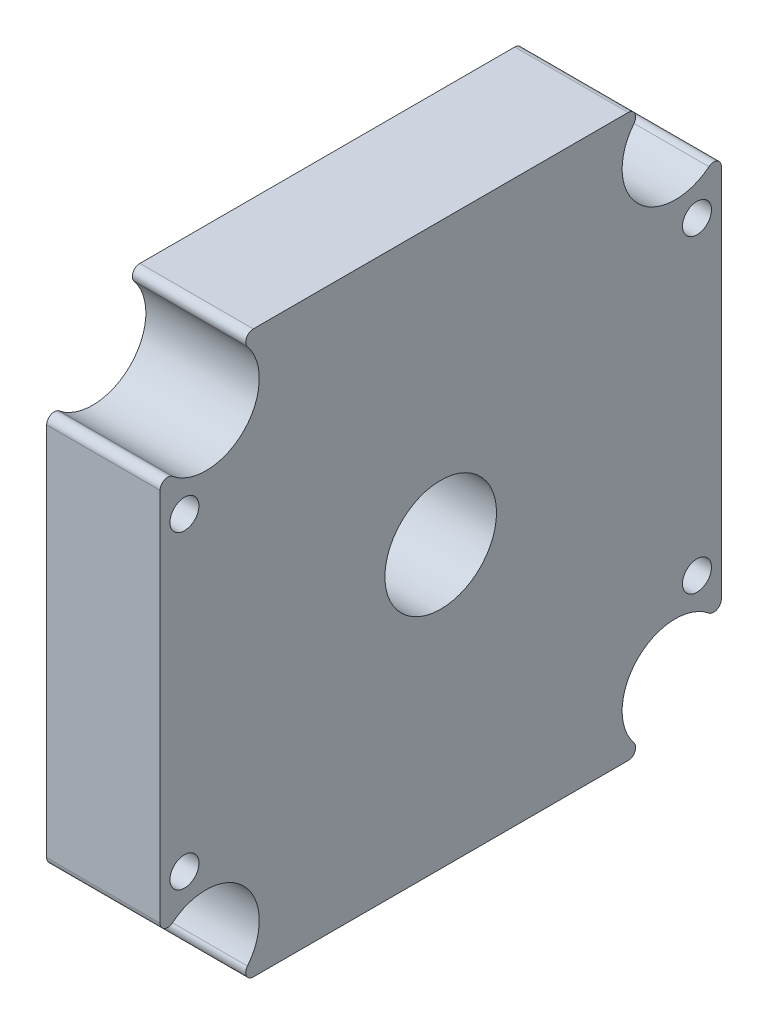
ISO-10303-21;
HEADER;
FILE_DESCRIPTION(('STEP AP214'),'2;1');
FILE_NAME('part.step','',(''),(''),'','','');
FILE_SCHEMA(('AUTOMOTIVE_DESIGN { 1 0 10303 214 1 1 1 1 }'));
ENDSEC;
DATA;
#1=APPLICATION_CONTEXT('core data for automotive mechanical design processes');
#2=APPLICATION_PROTOCOL_DEFINITION('international standard','automotive_design',2000,#1);
#3=PRODUCT_CONTEXT('',#1,'mechanical');
#4=PRODUCT('Part','Part','',(#3));
#5=PRODUCT_RELATED_PRODUCT_CATEGORY('part','',(#4));
#6=PRODUCT_DEFINITION_FORMATION('','',#4);
#7=PRODUCT_DEFINITION_CONTEXT('part definition',#1,'design');
#8=PRODUCT_DEFINITION('design','',#6,#7);
#9=PRODUCT_DEFINITION_SHAPE('','',#8);
#10=(LENGTH_UNIT() NAMED_UNIT(*) SI_UNIT(.MILLI.,.METRE.));
#11=(NAMED_UNIT(*) PLANE_ANGLE_UNIT() SI_UNIT($,.RADIAN.));
#12=(NAMED_UNIT(*) SI_UNIT($,.STERADIAN.) SOLID_ANGLE_UNIT());
#13=UNCERTAINTY_MEASURE_WITH_UNIT(LENGTH_MEASURE(1.E-05),#10,'distance_accuracy_value','');
#14=(GEOMETRIC_REPRESENTATION_CONTEXT(3) GLOBAL_UNCERTAINTY_ASSIGNED_CONTEXT((#13)) GLOBAL_UNIT_ASSIGNED_CONTEXT((#10,
#11,#12)) REPRESENTATION_CONTEXT('',''));
#15=CARTESIAN_POINT('',(0.,0.,0.));
#16=DIRECTION('',(0.,0.,1.));
#17=DIRECTION('',(1.,0.,0.));
#18=AXIS2_PLACEMENT_3D('',#15,#16,#17);
#19=CARTESIAN_POINT('',(11.3538,-28.0924,-28.0924));
#20=DIRECTION('',(0.,0.,1.));
#21=DIRECTION('',(1.,0.,0.));
#22=AXIS2_PLACEMENT_3D('',#19,#20,#21);
#23=PLANE('',#22);
#24=DIRECTION('',(0.,1.,0.));
#25=VECTOR('',#24,1.);
#26=CARTESIAN_POINT('',(11.3538,-28.0924,-28.0924));
#27=LINE('',#26,#25);
#28=CARTESIAN_POINT('',(11.3538,-18.7567595206659,-28.0924));
#29=VERTEX_POINT('',#28);
#30=CARTESIAN_POINT('',(11.3538,18.7567595206659,-28.0924));
#31=VERTEX_POINT('',#30);
#32=EDGE_CURVE('E258',#29,#31,#27,.T.);
#33=ORIENTED_EDGE('',*,*,#32,.F.);
#34=DIRECTION('',(-1.,0.,0.));
#35=VECTOR('',#34,1.);
#36=CARTESIAN_POINT('',(11.3538,-18.7567595206659,-28.0924));
#37=LINE('',#36,#35);
#38=CARTESIAN_POINT('',(0.,-18.7567595206659,-28.0924));
#39=VERTEX_POINT('',#38);
#40=EDGE_CURVE('E234',#29,#39,#37,.T.);
#41=ORIENTED_EDGE('',*,*,#40,.T.);
#42=DIRECTION('',(0.,1.,0.));
#43=VECTOR('',#42,1.);
#44=CARTESIAN_POINT('',(0.,-28.0924,-28.0924));
#45=LINE('',#44,#43);
#46=CARTESIAN_POINT('',(0.,18.7567595206659,-28.0924));
#47=VERTEX_POINT('',#46);
#48=EDGE_CURVE('E260',#39,#47,#45,.T.);
#49=ORIENTED_EDGE('',*,*,#48,.T.);
#50=DIRECTION('',(-1.,0.,0.));
#51=VECTOR('',#50,1.);
#52=CARTESIAN_POINT('',(11.3538,18.7567595206659,-28.0924));
#53=LINE('',#52,#51);
#54=EDGE_CURVE('E231',#47,#31,#53,.F.);
#55=ORIENTED_EDGE('',*,*,#54,.T.);
#56=EDGE_LOOP('',(#33,#41,#49,#55));
#57=FACE_BOUND('',#56,.T.);
#58=ADVANCED_FACE('F45',(#57),#23,.F.);
#59=CARTESIAN_POINT('',(11.3538,28.0924,28.0924));
#60=DIRECTION('',(0.,-1.,0.));
#61=DIRECTION('',(0.,0.,-1.));
#62=AXIS2_PLACEMENT_3D('',#59,#60,#61);
#63=PLANE('',#62);
#64=DIRECTION('',(0.,0.,1.));
#65=VECTOR('',#64,1.);
#66=CARTESIAN_POINT('',(11.3538,28.0924,28.0924));
#67=LINE('',#66,#65);
#68=CARTESIAN_POINT('',(11.3538,28.0924,-18.756759520666));
#69=VERTEX_POINT('',#68);
#70=CARTESIAN_POINT('',(11.3538,28.0924,18.7567595206659));
#71=VERTEX_POINT('',#70);
#72=EDGE_CURVE('E179',#69,#71,#67,.T.);
#73=ORIENTED_EDGE('',*,*,#72,.F.);
#74=DIRECTION('',(-1.,0.,0.));
#75=VECTOR('',#74,1.);
#76=CARTESIAN_POINT('',(11.3538,28.0924,-18.756759520666));
#77=LINE('',#76,#75);
#78=CARTESIAN_POINT('',(0.,28.0924,-18.756759520666));
#79=VERTEX_POINT('',#78);
#80=EDGE_CURVE('E240',#69,#79,#77,.T.);
#81=ORIENTED_EDGE('',*,*,#80,.T.);
#82=DIRECTION('',(0.,0.,1.));
#83=VECTOR('',#82,1.);
#84=CARTESIAN_POINT('',(0.,28.0924,28.0924));
#85=LINE('',#84,#83);
#86=CARTESIAN_POINT('',(0.,28.0924,18.7567595206659));
#87=VERTEX_POINT('',#86);
#88=EDGE_CURVE('E274',#79,#87,#85,.T.);
#89=ORIENTED_EDGE('',*,*,#88,.T.);
#90=DIRECTION('',(-1.,0.,0.));
#91=VECTOR('',#90,1.);
#92=CARTESIAN_POINT('',(11.3538,28.0924,18.7567595206659));
#93=LINE('',#92,#91);
#94=EDGE_CURVE('E237',#87,#71,#93,.F.);
#95=ORIENTED_EDGE('',*,*,#94,.T.);
#96=EDGE_LOOP('',(#73,#81,#89,#95));
#97=FACE_BOUND('',#96,.T.);
#98=ADVANCED_FACE('F309',(#97),#63,.F.);
#99=CARTESIAN_POINT('',(11.3538,-28.0924,28.0924));
#100=DIRECTION('',(0.,0.,-1.));
#101=DIRECTION('',(-1.,0.,0.));
#102=AXIS2_PLACEMENT_3D('',#99,#100,#101);
#103=PLANE('',#102);
#104=DIRECTION('',(0.,-1.,0.));
#105=VECTOR('',#104,1.);
#106=CARTESIAN_POINT('',(11.3538,-28.0924,28.0924));
#107=LINE('',#106,#105);
#108=CARTESIAN_POINT('',(11.3538,18.7567595206659,28.0924));
#109=VERTEX_POINT('',#108);
#110=CARTESIAN_POINT('',(11.3538,-18.7567595206659,28.0924));
#111=VERTEX_POINT('',#110);
#112=EDGE_CURVE('E160',#109,#111,#107,.T.);
#113=ORIENTED_EDGE('',*,*,#112,.F.);
#114=DIRECTION('',(-1.,0.,0.));
#115=VECTOR('',#114,1.);
#116=CARTESIAN_POINT('',(11.3538,18.7567595206659,28.0924));
#117=LINE('',#116,#115);
#118=CARTESIAN_POINT('',(0.,18.7567595206659,28.0924));
#119=VERTEX_POINT('',#118);
#120=EDGE_CURVE('E174',#109,#119,#117,.T.);
#121=ORIENTED_EDGE('',*,*,#120,.T.);
#122=DIRECTION('',(0.,-1.,0.));
#123=VECTOR('',#122,1.);
#124=CARTESIAN_POINT('',(0.,-28.0924,28.0924));
#125=LINE('',#124,#123);
#126=CARTESIAN_POINT('',(0.,-18.7567595206659,28.0924));
#127=VERTEX_POINT('',#126);
#128=EDGE_CURVE('E268',#119,#127,#125,.T.);
#129=ORIENTED_EDGE('',*,*,#128,.T.);
#130=DIRECTION('',(-1.,0.,0.));
#131=VECTOR('',#130,1.);
#132=CARTESIAN_POINT('',(11.3538,-18.7567595206659,28.0924));
#133=LINE('',#132,#131);
#134=EDGE_CURVE('E177',#127,#111,#133,.F.);
#135=ORIENTED_EDGE('',*,*,#134,.T.);
#136=EDGE_LOOP('',(#113,#121,#129,#135));
#137=FACE_BOUND('',#136,.T.);
#138=ADVANCED_FACE('F172',(#137),#103,.F.);
#139=CARTESIAN_POINT('',(11.3538,-28.0924,28.0924));
#140=DIRECTION('',(0.,1.,0.));
#141=DIRECTION('',(0.,0.,1.));
#142=AXIS2_PLACEMENT_3D('',#139,#140,#141);
#143=PLANE('',#142);
#144=DIRECTION('',(0.,0.,-1.));
#145=VECTOR('',#144,1.);
#146=CARTESIAN_POINT('',(11.3538,-28.0924,28.0924));
#147=LINE('',#146,#145);
#148=CARTESIAN_POINT('',(11.3538,-28.0924,18.756759520666));
#149=VERTEX_POINT('',#148);
#150=CARTESIAN_POINT('',(11.3538,-28.0924,-18.7567595206659));
#151=VERTEX_POINT('',#150);
#152=EDGE_CURVE('E178',#149,#151,#147,.T.);
#153=ORIENTED_EDGE('',*,*,#152,.F.);
#154=DIRECTION('',(-1.,0.,0.));
#155=VECTOR('',#154,1.);
#156=CARTESIAN_POINT('',(11.3538,-28.0924,18.756759520666));
#157=LINE('',#156,#155);
#158=CARTESIAN_POINT('',(0.,-28.0924,18.756759520666));
#159=VERTEX_POINT('',#158);
#160=EDGE_CURVE('E224',#149,#159,#157,.T.);
#161=ORIENTED_EDGE('',*,*,#160,.T.);
#162=DIRECTION('',(0.,0.,-1.));
#163=VECTOR('',#162,1.);
#164=CARTESIAN_POINT('',(0.,-28.0924,28.0924));
#165=LINE('',#164,#163);
#166=CARTESIAN_POINT('',(0.,-28.0924,-18.7567595206659));
#167=VERTEX_POINT('',#166);
#168=EDGE_CURVE('E263',#159,#167,#165,.T.);
#169=ORIENTED_EDGE('',*,*,#168,.T.);
#170=DIRECTION('',(-1.,0.,0.));
#171=VECTOR('',#170,1.);
#172=CARTESIAN_POINT('',(11.3538,-28.0924,-18.7567595206659));
#173=LINE('',#172,#171);
#174=EDGE_CURVE('E221',#167,#151,#173,.F.);
#175=ORIENTED_EDGE('',*,*,#174,.T.);
#176=EDGE_LOOP('',(#153,#161,#169,#175));
#177=FACE_BOUND('',#176,.T.);
#178=ADVANCED_FACE('F360',(#177),#143,.F.);
#179=CARTESIAN_POINT('',(11.3538,0.,0.));
#180=DIRECTION('',(-1.,0.,0.));
#181=DIRECTION('',(0.,0.,1.));
#182=AXIS2_PLACEMENT_3D('',#179,#180,#181);
#183=PLANE('',#182);
#184=CARTESIAN_POINT('',(11.3538,0.,0.));
#185=DIRECTION('',(1.,0.,0.));
#186=DIRECTION('',(0.,0.,-1.));
#187=AXIS2_PLACEMENT_3D('',#184,#185,#186);
#188=CIRCLE('',#187,5.588);
#189=CARTESIAN_POINT('',(11.3538,0.,-5.588));
#190=VERTEX_POINT('',#189);
#191=EDGE_CURVE('E343',#190,#190,#188,.T.);
#192=ORIENTED_EDGE('',*,*,#191,.F.);
#193=EDGE_LOOP('',(#192));
#194=FACE_BOUND('',#193,.T.);
#195=CARTESIAN_POINT('',(11.3538,15.494,25.654));
#196=DIRECTION('',(1.,0.,0.));
#197=DIRECTION('',(0.,0.,-1.));
#198=AXIS2_PLACEMENT_3D('',#195,#196,#197);
#199=CIRCLE('',#198,1.45);
#200=CARTESIAN_POINT('',(11.3538,15.494,24.204));
#201=VERTEX_POINT('',#200);
#202=EDGE_CURVE('E339',#201,#201,#199,.T.);
#203=ORIENTED_EDGE('',*,*,#202,.F.);
#204=EDGE_LOOP('',(#203));
#205=FACE_BOUND('',#204,.T.);
#206=CARTESIAN_POINT('',(11.3538,15.494,-25.654));
#207=DIRECTION('',(1.,0.,0.));
#208=DIRECTION('',(0.,0.,-1.));
#209=AXIS2_PLACEMENT_3D('',#206,#207,#208);
#210=CIRCLE('',#209,1.45);
#211=CARTESIAN_POINT('',(11.3538,15.494,-27.104));
#212=VERTEX_POINT('',#211);
#213=EDGE_CURVE('E333',#212,#212,#210,.T.);
#214=ORIENTED_EDGE('',*,*,#213,.F.);
#215=EDGE_LOOP('',(#214));
#216=FACE_BOUND('',#215,.T.);
#217=CARTESIAN_POINT('',(11.3538,-15.494,-25.654));
#218=DIRECTION('',(1.,0.,0.));
#219=DIRECTION('',(0.,0.,-1.));
#220=AXIS2_PLACEMENT_3D('',#217,#218,#219);
#221=CIRCLE('',#220,1.45);
#222=CARTESIAN_POINT('',(11.3538,-15.494,-27.104));
#223=VERTEX_POINT('',#222);
#224=EDGE_CURVE('E327',#223,#223,#221,.T.);
#225=ORIENTED_EDGE('',*,*,#224,.F.);
#226=EDGE_LOOP('',(#225));
#227=FACE_BOUND('',#226,.T.);
#228=CARTESIAN_POINT('',(11.3538,-15.494,25.654));
#229=DIRECTION('',(1.,0.,0.));
#230=DIRECTION('',(0.,0.,-1.));
#231=AXIS2_PLACEMENT_3D('',#228,#229,#230);
#232=CIRCLE('',#231,1.45);
#233=CARTESIAN_POINT('',(11.3538,-15.494,24.204));
#234=VERTEX_POINT('',#233);
#235=EDGE_CURVE('E321',#234,#234,#232,.T.);
#236=ORIENTED_EDGE('',*,*,#235,.F.);
#237=EDGE_LOOP('',(#236));
#238=FACE_BOUND('',#237,.T.);
#239=CARTESIAN_POINT('',(11.3538,23.495,23.495));
#240=DIRECTION('',(-1.,0.,0.));
#241=DIRECTION('',(0.,0.,1.));
#242=AXIS2_PLACEMENT_3D('',#239,#240,#241);
#243=CIRCLE('',#242,5.334);
#244=CARTESIAN_POINT('',(11.3538,26.850975,19.3490395805827));
#245=VERTEX_POINT('',#244);
#246=CARTESIAN_POINT('',(11.3538,19.3490395805827,26.850975));
#247=VERTEX_POINT('',#246);
#248=EDGE_CURVE('E162',#245,#247,#243,.T.);
#249=ORIENTED_EDGE('',*,*,#248,.T.);
#250=CARTESIAN_POINT('',(11.3538,18.7567595206659,27.3304));
#251=DIRECTION('',(-1.,0.,0.));
#252=DIRECTION('',(0.,0.,1.));
#253=AXIS2_PLACEMENT_3D('',#250,#251,#252);
#254=CIRCLE('',#253,0.762);
#255=EDGE_CURVE('E157',#247,#109,#254,.F.);
#256=ORIENTED_EDGE('',*,*,#255,.T.);
#257=ORIENTED_EDGE('',*,*,#112,.T.);
#258=CARTESIAN_POINT('',(11.3538,-18.7567595206659,27.3304));
#259=DIRECTION('',(-1.,0.,0.));
#260=DIRECTION('',(0.,0.,1.));
#261=AXIS2_PLACEMENT_3D('',#258,#259,#260);
#262=CIRCLE('',#261,0.762);
#263=CARTESIAN_POINT('',(11.3538,-19.3490395805826,26.850975));
#264=VERTEX_POINT('',#263);
#265=EDGE_CURVE('E167',#111,#264,#262,.F.);
#266=ORIENTED_EDGE('',*,*,#265,.T.);
#267=CARTESIAN_POINT('',(11.3538,-23.495,23.495));
#268=DIRECTION('',(-1.,0.,0.));
#269=DIRECTION('',(0.,0.,1.));
#270=AXIS2_PLACEMENT_3D('',#267,#268,#269);
#271=CIRCLE('',#270,5.334);
#272=CARTESIAN_POINT('',(11.3538,-26.850975,19.3490395805827));
#273=VERTEX_POINT('',#272);
#274=EDGE_CURVE('E283',#264,#273,#271,.T.);
#275=ORIENTED_EDGE('',*,*,#274,.T.);
#276=CARTESIAN_POINT('',(11.3538,-27.3304,18.756759520666));
#277=DIRECTION('',(-1.,0.,0.));
#278=DIRECTION('',(0.,0.,1.));
#279=AXIS2_PLACEMENT_3D('',#276,#277,#278);
#280=CIRCLE('',#279,0.762);
#281=EDGE_CURVE('E215',#273,#149,#280,.F.);
#282=ORIENTED_EDGE('',*,*,#281,.T.);
#283=ORIENTED_EDGE('',*,*,#152,.T.);
#284=CARTESIAN_POINT('',(11.3538,-27.3304,-18.7567595206659));
#285=DIRECTION('',(-1.,0.,0.));
#286=DIRECTION('',(0.,0.,1.));
#287=AXIS2_PLACEMENT_3D('',#284,#285,#286);
#288=CIRCLE('',#287,0.762);
#289=CARTESIAN_POINT('',(11.3538,-26.850975,-19.3490395805827));
#290=VERTEX_POINT('',#289);
#291=EDGE_CURVE('E213',#151,#290,#288,.F.);
#292=ORIENTED_EDGE('',*,*,#291,.T.);
#293=CARTESIAN_POINT('',(11.3538,-23.495,-23.495));
#294=DIRECTION('',(-1.,0.,0.));
#295=DIRECTION('',(0.,0.,1.));
#296=AXIS2_PLACEMENT_3D('',#293,#294,#295);
#297=CIRCLE('',#296,5.334);
#298=CARTESIAN_POINT('',(11.3538,-19.3490395805827,-26.850975));
#299=VERTEX_POINT('',#298);
#300=EDGE_CURVE('E295',#290,#299,#297,.T.);
#301=ORIENTED_EDGE('',*,*,#300,.T.);
#302=CARTESIAN_POINT('',(11.3538,-18.7567595206659,-27.3304));
#303=DIRECTION('',(-1.,0.,0.));
#304=DIRECTION('',(0.,0.,1.));
#305=AXIS2_PLACEMENT_3D('',#302,#303,#304);
#306=CIRCLE('',#305,0.762);
#307=EDGE_CURVE('E211',#299,#29,#306,.F.);
#308=ORIENTED_EDGE('',*,*,#307,.T.);
#309=ORIENTED_EDGE('',*,*,#32,.T.);
#310=CARTESIAN_POINT('',(11.3538,18.7567595206659,-27.3304));
#311=DIRECTION('',(-1.,0.,0.));
#312=DIRECTION('',(0.,0.,1.));
#313=AXIS2_PLACEMENT_3D('',#310,#311,#312);
#314=CIRCLE('',#313,0.762);
#315=CARTESIAN_POINT('',(11.3538,19.3490395805826,-26.850975));
#316=VERTEX_POINT('',#315);
#317=EDGE_CURVE('E65',#31,#316,#314,.F.);
#318=ORIENTED_EDGE('',*,*,#317,.T.);
#319=CARTESIAN_POINT('',(11.3538,23.495,-23.495));
#320=DIRECTION('',(-1.,0.,0.));
#321=DIRECTION('',(0.,0.,1.));
#322=AXIS2_PLACEMENT_3D('',#319,#320,#321);
#323=CIRCLE('',#322,5.334);
#324=CARTESIAN_POINT('',(11.3538,26.850975,-19.3490395805827));
#325=VERTEX_POINT('',#324);
#326=EDGE_CURVE('E246',#316,#325,#323,.T.);
#327=ORIENTED_EDGE('',*,*,#326,.T.);
#328=CARTESIAN_POINT('',(11.3538,27.3304,-18.756759520666));
#329=DIRECTION('',(-1.,0.,0.));
#330=DIRECTION('',(0.,0.,1.));
#331=AXIS2_PLACEMENT_3D('',#328,#329,#330);
#332=CIRCLE('',#331,0.762);
#333=EDGE_CURVE('E209',#325,#69,#332,.F.);
#334=ORIENTED_EDGE('',*,*,#333,.T.);
#335=ORIENTED_EDGE('',*,*,#72,.T.);
#336=CARTESIAN_POINT('',(11.3538,27.3304,18.7567595206659));
#337=DIRECTION('',(-1.,0.,0.));
#338=DIRECTION('',(0.,0.,1.));
#339=AXIS2_PLACEMENT_3D('',#336,#337,#338);
#340=CIRCLE('',#339,0.762);
#341=EDGE_CURVE('E207',#71,#245,#340,.F.);
#342=ORIENTED_EDGE('',*,*,#341,.T.);
#343=EDGE_LOOP('',(#249,#256,#257,#266,#275,#282,#283,#292,#301,#308,#309,#318,#327,#334,#335,#342));
#344=FACE_BOUND('',#343,.T.);
#345=ADVANCED_FACE('F159',(#194,#205,#216,#227,#238,#344),#183,.F.);
#346=CARTESIAN_POINT('',(0.,0.,0.));
#347=DIRECTION('',(-1.,0.,0.));
#348=DIRECTION('',(0.,0.,1.));
#349=AXIS2_PLACEMENT_3D('',#346,#347,#348);
#350=PLANE('',#349);
#351=CARTESIAN_POINT('',(0.,0.,0.));
#352=DIRECTION('',(1.,0.,0.));
#353=DIRECTION('',(0.,0.,-1.));
#354=AXIS2_PLACEMENT_3D('',#351,#352,#353);
#355=CIRCLE('',#354,5.588);
#356=CARTESIAN_POINT('',(0.,0.,-5.588));
#357=VERTEX_POINT('',#356);
#358=EDGE_CURVE('E342',#357,#357,#355,.T.);
#359=ORIENTED_EDGE('',*,*,#358,.T.);
#360=EDGE_LOOP('',(#359));
#361=FACE_BOUND('',#360,.T.);
#362=CARTESIAN_POINT('',(0.,15.494,25.654));
#363=DIRECTION('',(1.,0.,0.));
#364=DIRECTION('',(0.,0.,-1.));
#365=AXIS2_PLACEMENT_3D('',#362,#363,#364);
#366=CIRCLE('',#365,1.45);
#367=CARTESIAN_POINT('',(0.,15.494,24.204));
#368=VERTEX_POINT('',#367);
#369=EDGE_CURVE('E336',#368,#368,#366,.T.);
#370=ORIENTED_EDGE('',*,*,#369,.T.);
#371=EDGE_LOOP('',(#370));
#372=FACE_BOUND('',#371,.T.);
#373=CARTESIAN_POINT('',(0.,15.494,-25.654));
#374=DIRECTION('',(1.,0.,0.));
#375=DIRECTION('',(0.,0.,-1.));
#376=AXIS2_PLACEMENT_3D('',#373,#374,#375);
#377=CIRCLE('',#376,1.45);
#378=CARTESIAN_POINT('',(0.,15.494,-27.104));
#379=VERTEX_POINT('',#378);
#380=EDGE_CURVE('E330',#379,#379,#377,.T.);
#381=ORIENTED_EDGE('',*,*,#380,.T.);
#382=EDGE_LOOP('',(#381));
#383=FACE_BOUND('',#382,.T.);
#384=CARTESIAN_POINT('',(0.,-15.494,-25.654));
#385=DIRECTION('',(1.,0.,0.));
#386=DIRECTION('',(0.,0.,-1.));
#387=AXIS2_PLACEMENT_3D('',#384,#385,#386);
#388=CIRCLE('',#387,1.45);
#389=CARTESIAN_POINT('',(0.,-15.494,-27.104));
#390=VERTEX_POINT('',#389);
#391=EDGE_CURVE('E324',#390,#390,#388,.T.);
#392=ORIENTED_EDGE('',*,*,#391,.T.);
#393=EDGE_LOOP('',(#392));
#394=FACE_BOUND('',#393,.T.);
#395=CARTESIAN_POINT('',(0.,-15.494,25.654));
#396=DIRECTION('',(1.,0.,0.));
#397=DIRECTION('',(0.,0.,-1.));
#398=AXIS2_PLACEMENT_3D('',#395,#396,#397);
#399=CIRCLE('',#398,1.45);
#400=CARTESIAN_POINT('',(0.,-15.494,24.204));
#401=VERTEX_POINT('',#400);
#402=EDGE_CURVE('E302',#401,#401,#399,.T.);
#403=ORIENTED_EDGE('',*,*,#402,.T.);
#404=EDGE_LOOP('',(#403));
#405=FACE_BOUND('',#404,.T.);
#406=ORIENTED_EDGE('',*,*,#128,.F.);
#407=CARTESIAN_POINT('',(0.,18.7567595206659,27.3304));
#408=DIRECTION('',(-1.,0.,0.));
#409=DIRECTION('',(0.,0.,1.));
#410=AXIS2_PLACEMENT_3D('',#407,#408,#409);
#411=CIRCLE('',#410,0.762);
#412=CARTESIAN_POINT('',(0.,19.3490395805827,26.850975));
#413=VERTEX_POINT('',#412);
#414=EDGE_CURVE('E182',#119,#413,#411,.T.);
#415=ORIENTED_EDGE('',*,*,#414,.T.);
#416=CARTESIAN_POINT('',(0.,23.495,23.495));
#417=DIRECTION('',(-1.,0.,0.));
#418=DIRECTION('',(0.,0.,1.));
#419=AXIS2_PLACEMENT_3D('',#416,#417,#418);
#420=CIRCLE('',#419,5.334);
#421=CARTESIAN_POINT('',(0.,26.850975,19.3490395805827));
#422=VERTEX_POINT('',#421);
#423=EDGE_CURVE('E290',#422,#413,#420,.T.);
#424=ORIENTED_EDGE('',*,*,#423,.F.);
#425=CARTESIAN_POINT('',(0.,27.3304,18.7567595206659));
#426=DIRECTION('',(-1.,0.,0.));
#427=DIRECTION('',(0.,0.,1.));
#428=AXIS2_PLACEMENT_3D('',#425,#426,#427);
#429=CIRCLE('',#428,0.762);
#430=EDGE_CURVE('E185',#422,#87,#429,.T.);
#431=ORIENTED_EDGE('',*,*,#430,.T.);
#432=ORIENTED_EDGE('',*,*,#88,.F.);
#433=CARTESIAN_POINT('',(0.,27.3304,-18.756759520666));
#434=DIRECTION('',(-1.,0.,0.));
#435=DIRECTION('',(0.,0.,1.));
#436=AXIS2_PLACEMENT_3D('',#433,#434,#435);
#437=CIRCLE('',#436,0.762);
#438=CARTESIAN_POINT('',(0.,26.850975,-19.3490395805827));
#439=VERTEX_POINT('',#438);
#440=EDGE_CURVE('E191',#79,#439,#437,.T.);
#441=ORIENTED_EDGE('',*,*,#440,.T.);
#442=CARTESIAN_POINT('',(0.,23.495,-23.495));
#443=DIRECTION('',(-1.,0.,0.));
#444=DIRECTION('',(0.,0.,1.));
#445=AXIS2_PLACEMENT_3D('',#442,#443,#444);
#446=CIRCLE('',#445,5.334);
#447=CARTESIAN_POINT('',(0.,19.3490395805826,-26.850975));
#448=VERTEX_POINT('',#447);
#449=EDGE_CURVE('E245',#448,#439,#446,.T.);
#450=ORIENTED_EDGE('',*,*,#449,.F.);
#451=CARTESIAN_POINT('',(0.,18.7567595206659,-27.3304));
#452=DIRECTION('',(-1.,0.,0.));
#453=DIRECTION('',(0.,0.,1.));
#454=AXIS2_PLACEMENT_3D('',#451,#452,#453);
#455=CIRCLE('',#454,0.762);
#456=EDGE_CURVE('E183',#448,#47,#455,.T.);
#457=ORIENTED_EDGE('',*,*,#456,.T.);
#458=ORIENTED_EDGE('',*,*,#48,.F.);
#459=CARTESIAN_POINT('',(0.,-18.7567595206659,-27.3304));
#460=DIRECTION('',(-1.,0.,0.));
#461=DIRECTION('',(0.,0.,1.));
#462=AXIS2_PLACEMENT_3D('',#459,#460,#461);
#463=CIRCLE('',#462,0.762);
#464=CARTESIAN_POINT('',(0.,-19.3490395805827,-26.850975));
#465=VERTEX_POINT('',#464);
#466=EDGE_CURVE('E193',#39,#465,#463,.T.);
#467=ORIENTED_EDGE('',*,*,#466,.T.);
#468=CARTESIAN_POINT('',(0.,-23.495,-23.495));
#469=DIRECTION('',(-1.,0.,0.));
#470=DIRECTION('',(0.,0.,1.));
#471=AXIS2_PLACEMENT_3D('',#468,#469,#470);
#472=CIRCLE('',#471,5.334);
#473=CARTESIAN_POINT('',(0.,-26.850975,-19.3490395805827));
#474=VERTEX_POINT('',#473);
#475=EDGE_CURVE('E300',#474,#465,#472,.T.);
#476=ORIENTED_EDGE('',*,*,#475,.F.);
#477=CARTESIAN_POINT('',(0.,-27.3304,-18.7567595206659));
#478=DIRECTION('',(-1.,0.,0.));
#479=DIRECTION('',(0.,0.,1.));
#480=AXIS2_PLACEMENT_3D('',#477,#478,#479);
#481=CIRCLE('',#480,0.762);
#482=EDGE_CURVE('E195',#474,#167,#481,.T.);
#483=ORIENTED_EDGE('',*,*,#482,.T.);
#484=ORIENTED_EDGE('',*,*,#168,.F.);
#485=CARTESIAN_POINT('',(0.,-27.3304,18.756759520666));
#486=DIRECTION('',(-1.,0.,0.));
#487=DIRECTION('',(0.,0.,1.));
#488=AXIS2_PLACEMENT_3D('',#485,#486,#487);
#489=CIRCLE('',#488,0.762);
#490=CARTESIAN_POINT('',(0.,-26.850975,19.3490395805827));
#491=VERTEX_POINT('',#490);
#492=EDGE_CURVE('E197',#159,#491,#489,.T.);
#493=ORIENTED_EDGE('',*,*,#492,.T.);
#494=CARTESIAN_POINT('',(0.,-23.495,23.495));
#495=DIRECTION('',(-1.,0.,0.));
#496=DIRECTION('',(0.,0.,1.));
#497=AXIS2_PLACEMENT_3D('',#494,#495,#496);
#498=CIRCLE('',#497,5.334);
#499=CARTESIAN_POINT('',(0.,-19.3490395805826,26.850975));
#500=VERTEX_POINT('',#499);
#501=EDGE_CURVE('E291',#500,#491,#498,.T.);
#502=ORIENTED_EDGE('',*,*,#501,.F.);
#503=CARTESIAN_POINT('',(0.,-18.7567595206659,27.3304));
#504=DIRECTION('',(-1.,0.,0.));
#505=DIRECTION('',(0.,0.,1.));
#506=AXIS2_PLACEMENT_3D('',#503,#504,#505);
#507=CIRCLE('',#506,0.762);
#508=EDGE_CURVE('E199',#500,#127,#507,.T.);
#509=ORIENTED_EDGE('',*,*,#508,.T.);
#510=EDGE_LOOP('',(#406,#415,#424,#431,#432,#441,#450,#457,#458,#467,#476,#483,#484,#493,#502,#509));
#511=FACE_BOUND('',#510,.T.);
#512=ADVANCED_FACE('F250',(#361,#372,#383,#394,#405,#511),#350,.T.);
#513=CARTESIAN_POINT('',(11.3538,23.495,-23.495));
#514=DIRECTION('',(-1.,0.,0.));
#515=DIRECTION('',(0.,0.,1.));
#516=AXIS2_PLACEMENT_3D('',#513,#514,#515);
#517=CYLINDRICAL_SURFACE('',#516,5.334);
#518=ORIENTED_EDGE('',*,*,#449,.T.);
#519=DIRECTION('',(-1.,0.,0.));
#520=VECTOR('',#519,1.);
#521=CARTESIAN_POINT('',(11.3538,26.850975,-19.3490395805827));
#522=LINE('',#521,#520);
#523=EDGE_CURVE('E11',#439,#325,#522,.F.);
#524=ORIENTED_EDGE('',*,*,#523,.T.);
#525=ORIENTED_EDGE('',*,*,#326,.F.);
#526=DIRECTION('',(-1.,0.,0.));
#527=VECTOR('',#526,1.);
#528=CARTESIAN_POINT('',(11.3538,19.3490395805826,-26.850975));
#529=LINE('',#528,#527);
#530=EDGE_CURVE('E53',#316,#448,#529,.T.);
#531=ORIENTED_EDGE('',*,*,#530,.T.);
#532=EDGE_LOOP('',(#518,#524,#525,#531));
#533=FACE_BOUND('',#532,.T.);
#534=ADVANCED_FACE('F244',(#533),#517,.F.);
#535=CARTESIAN_POINT('',(11.3538,-23.495,-23.495));
#536=DIRECTION('',(-1.,0.,0.));
#537=DIRECTION('',(0.,0.,1.));
#538=AXIS2_PLACEMENT_3D('',#535,#536,#537);
#539=CYLINDRICAL_SURFACE('',#538,5.334);
#540=ORIENTED_EDGE('',*,*,#300,.F.);
#541=DIRECTION('',(-1.,0.,0.));
#542=VECTOR('',#541,1.);
#543=CARTESIAN_POINT('',(11.3538,-26.850975,-19.3490395805827));
#544=LINE('',#543,#542);
#545=EDGE_CURVE('E229',#290,#474,#544,.T.);
#546=ORIENTED_EDGE('',*,*,#545,.T.);
#547=ORIENTED_EDGE('',*,*,#475,.T.);
#548=DIRECTION('',(-1.,0.,0.));
#549=VECTOR('',#548,1.);
#550=CARTESIAN_POINT('',(11.3538,-19.3490395805827,-26.850975));
#551=LINE('',#550,#549);
#552=EDGE_CURVE('E227',#465,#299,#551,.F.);
#553=ORIENTED_EDGE('',*,*,#552,.T.);
#554=EDGE_LOOP('',(#540,#546,#547,#553));
#555=FACE_BOUND('',#554,.T.);
#556=ADVANCED_FACE('F478',(#555),#539,.F.);
#557=CARTESIAN_POINT('',(11.3538,-23.495,23.495));
#558=DIRECTION('',(-1.,0.,0.));
#559=DIRECTION('',(0.,0.,1.));
#560=AXIS2_PLACEMENT_3D('',#557,#558,#559);
#561=CYLINDRICAL_SURFACE('',#560,5.334);
#562=ORIENTED_EDGE('',*,*,#274,.F.);
#563=DIRECTION('',(-1.,0.,0.));
#564=VECTOR('',#563,1.);
#565=CARTESIAN_POINT('',(11.3538,-19.3490395805826,26.850975));
#566=LINE('',#565,#564);
#567=EDGE_CURVE('E219',#264,#500,#566,.T.);
#568=ORIENTED_EDGE('',*,*,#567,.T.);
#569=ORIENTED_EDGE('',*,*,#501,.T.);
#570=DIRECTION('',(-1.,0.,0.));
#571=VECTOR('',#570,1.);
#572=CARTESIAN_POINT('',(11.3538,-26.850975,19.3490395805827));
#573=LINE('',#572,#571);
#574=EDGE_CURVE('E166',#491,#273,#573,.F.);
#575=ORIENTED_EDGE('',*,*,#574,.T.);
#576=EDGE_LOOP('',(#562,#568,#569,#575));
#577=FACE_BOUND('',#576,.T.);
#578=ADVANCED_FACE('F286',(#577),#561,.F.);
#579=CARTESIAN_POINT('',(11.3538,23.495,23.495));
#580=DIRECTION('',(-1.,0.,0.));
#581=DIRECTION('',(0.,0.,1.));
#582=AXIS2_PLACEMENT_3D('',#579,#580,#581);
#583=CYLINDRICAL_SURFACE('',#582,5.334);
#584=ORIENTED_EDGE('',*,*,#423,.T.);
#585=DIRECTION('',(-1.,0.,0.));
#586=VECTOR('',#585,1.);
#587=CARTESIAN_POINT('',(11.3538,19.3490395805827,26.850975));
#588=LINE('',#587,#586);
#589=EDGE_CURVE('E204',#413,#247,#588,.F.);
#590=ORIENTED_EDGE('',*,*,#589,.T.);
#591=ORIENTED_EDGE('',*,*,#248,.F.);
#592=DIRECTION('',(-1.,0.,0.));
#593=VECTOR('',#592,1.);
#594=CARTESIAN_POINT('',(11.3538,26.850975,19.3490395805827));
#595=LINE('',#594,#593);
#596=EDGE_CURVE('E202',#245,#422,#595,.T.);
#597=ORIENTED_EDGE('',*,*,#596,.T.);
#598=EDGE_LOOP('',(#584,#590,#591,#597));
#599=FACE_BOUND('',#598,.T.);
#600=ADVANCED_FACE('F317',(#599),#583,.F.);
#601=CARTESIAN_POINT('',(11.3538,18.7567595206659,27.3304));
#602=DIRECTION('',(-1.,0.,0.));
#603=DIRECTION('',(0.,0.,1.));
#604=AXIS2_PLACEMENT_3D('',#601,#602,#603);
#605=CYLINDRICAL_SURFACE('',#604,0.762);
#606=ORIENTED_EDGE('',*,*,#255,.F.);
#607=ORIENTED_EDGE('',*,*,#589,.F.);
#608=ORIENTED_EDGE('',*,*,#414,.F.);
#609=ORIENTED_EDGE('',*,*,#120,.F.);
#610=EDGE_LOOP('',(#606,#607,#608,#609));
#611=FACE_BOUND('',#610,.T.);
#612=ADVANCED_FACE('F181',(#611),#605,.T.);
#613=CARTESIAN_POINT('',(11.3538,-18.7567595206659,27.3304));
#614=DIRECTION('',(-1.,0.,0.));
#615=DIRECTION('',(0.,0.,1.));
#616=AXIS2_PLACEMENT_3D('',#613,#614,#615);
#617=CYLINDRICAL_SURFACE('',#616,0.762);
#618=ORIENTED_EDGE('',*,*,#508,.F.);
#619=ORIENTED_EDGE('',*,*,#567,.F.);
#620=ORIENTED_EDGE('',*,*,#265,.F.);
#621=ORIENTED_EDGE('',*,*,#134,.F.);
#622=EDGE_LOOP('',(#618,#619,#620,#621));
#623=FACE_BOUND('',#622,.T.);
#624=ADVANCED_FACE('F279',(#623),#617,.T.);
#625=CARTESIAN_POINT('',(11.3538,-27.3304,18.756759520666));
#626=DIRECTION('',(-1.,0.,0.));
#627=DIRECTION('',(0.,0.,1.));
#628=AXIS2_PLACEMENT_3D('',#625,#626,#627);
#629=CYLINDRICAL_SURFACE('',#628,0.762);
#630=ORIENTED_EDGE('',*,*,#281,.F.);
#631=ORIENTED_EDGE('',*,*,#574,.F.);
#632=ORIENTED_EDGE('',*,*,#492,.F.);
#633=ORIENTED_EDGE('',*,*,#160,.F.);
#634=EDGE_LOOP('',(#630,#631,#632,#633));
#635=FACE_BOUND('',#634,.T.);
#636=ADVANCED_FACE('F396',(#635),#629,.T.);
#637=CARTESIAN_POINT('',(11.3538,-27.3304,-18.7567595206659));
#638=DIRECTION('',(-1.,0.,0.));
#639=DIRECTION('',(0.,0.,1.));
#640=AXIS2_PLACEMENT_3D('',#637,#638,#639);
#641=CYLINDRICAL_SURFACE('',#640,0.762);
#642=ORIENTED_EDGE('',*,*,#482,.F.);
#643=ORIENTED_EDGE('',*,*,#545,.F.);
#644=ORIENTED_EDGE('',*,*,#291,.F.);
#645=ORIENTED_EDGE('',*,*,#174,.F.);
#646=EDGE_LOOP('',(#642,#643,#644,#645));
#647=FACE_BOUND('',#646,.T.);
#648=ADVANCED_FACE('F399',(#647),#641,.T.);
#649=CARTESIAN_POINT('',(11.3538,-18.7567595206659,-27.3304));
#650=DIRECTION('',(-1.,0.,0.));
#651=DIRECTION('',(0.,0.,1.));
#652=AXIS2_PLACEMENT_3D('',#649,#650,#651);
#653=CYLINDRICAL_SURFACE('',#652,0.762);
#654=ORIENTED_EDGE('',*,*,#307,.F.);
#655=ORIENTED_EDGE('',*,*,#552,.F.);
#656=ORIENTED_EDGE('',*,*,#466,.F.);
#657=ORIENTED_EDGE('',*,*,#40,.F.);
#658=EDGE_LOOP('',(#654,#655,#656,#657));
#659=FACE_BOUND('',#658,.T.);
#660=ADVANCED_FACE('F403',(#659),#653,.T.);
#661=CARTESIAN_POINT('',(11.3538,27.3304,-18.756759520666));
#662=DIRECTION('',(-1.,0.,0.));
#663=DIRECTION('',(0.,0.,1.));
#664=AXIS2_PLACEMENT_3D('',#661,#662,#663);
#665=CYLINDRICAL_SURFACE('',#664,0.762);
#666=ORIENTED_EDGE('',*,*,#333,.F.);
#667=ORIENTED_EDGE('',*,*,#523,.F.);
#668=ORIENTED_EDGE('',*,*,#440,.F.);
#669=ORIENTED_EDGE('',*,*,#80,.F.);
#670=EDGE_LOOP('',(#666,#667,#668,#669));
#671=FACE_BOUND('',#670,.T.);
#672=ADVANCED_FACE('F307',(#671),#665,.T.);
#673=CARTESIAN_POINT('',(11.3538,27.3304,18.7567595206659));
#674=DIRECTION('',(-1.,0.,0.));
#675=DIRECTION('',(0.,0.,1.));
#676=AXIS2_PLACEMENT_3D('',#673,#674,#675);
#677=CYLINDRICAL_SURFACE('',#676,0.762);
#678=ORIENTED_EDGE('',*,*,#430,.F.);
#679=ORIENTED_EDGE('',*,*,#596,.F.);
#680=ORIENTED_EDGE('',*,*,#341,.F.);
#681=ORIENTED_EDGE('',*,*,#94,.F.);
#682=EDGE_LOOP('',(#678,#679,#680,#681));
#683=FACE_BOUND('',#682,.T.);
#684=ADVANCED_FACE('F315',(#683),#677,.T.);
#685=CARTESIAN_POINT('',(11.3538,18.7567595206659,-27.3304));
#686=DIRECTION('',(-1.,0.,0.));
#687=DIRECTION('',(0.,0.,1.));
#688=AXIS2_PLACEMENT_3D('',#685,#686,#687);
#689=CYLINDRICAL_SURFACE('',#688,0.762);
#690=ORIENTED_EDGE('',*,*,#456,.F.);
#691=ORIENTED_EDGE('',*,*,#530,.F.);
#692=ORIENTED_EDGE('',*,*,#317,.F.);
#693=ORIENTED_EDGE('',*,*,#54,.F.);
#694=EDGE_LOOP('',(#690,#691,#692,#693));
#695=FACE_BOUND('',#694,.T.);
#696=ADVANCED_FACE('F47',(#695),#689,.T.);
#697=CARTESIAN_POINT('',(11.3538,-15.494,25.654));
#698=DIRECTION('',(1.,0.,0.));
#699=DIRECTION('',(0.,0.,-1.));
#700=AXIS2_PLACEMENT_3D('',#697,#698,#699);
#701=CYLINDRICAL_SURFACE('',#700,1.45);
#702=ORIENTED_EDGE('',*,*,#402,.F.);
#703=EDGE_LOOP('',(#702));
#704=FACE_BOUND('',#703,.T.);
#705=ORIENTED_EDGE('',*,*,#235,.T.);
#706=EDGE_LOOP('',(#705));
#707=FACE_BOUND('',#706,.T.);
#708=ADVANCED_FACE('F370',(#704,#707),#701,.F.);
#709=CARTESIAN_POINT('',(11.3538,-15.494,-25.654));
#710=DIRECTION('',(1.,0.,0.));
#711=DIRECTION('',(0.,0.,-1.));
#712=AXIS2_PLACEMENT_3D('',#709,#710,#711);
#713=CYLINDRICAL_SURFACE('',#712,1.45);
#714=ORIENTED_EDGE('',*,*,#391,.F.);
#715=EDGE_LOOP('',(#714));
#716=FACE_BOUND('',#715,.T.);
#717=ORIENTED_EDGE('',*,*,#224,.T.);
#718=EDGE_LOOP('',(#717));
#719=FACE_BOUND('',#718,.T.);
#720=ADVANCED_FACE('F372',(#716,#719),#713,.F.);
#721=CARTESIAN_POINT('',(11.3538,15.494,-25.654));
#722=DIRECTION('',(1.,0.,0.));
#723=DIRECTION('',(0.,0.,-1.));
#724=AXIS2_PLACEMENT_3D('',#721,#722,#723);
#725=CYLINDRICAL_SURFACE('',#724,1.45);
#726=ORIENTED_EDGE('',*,*,#380,.F.);
#727=EDGE_LOOP('',(#726));
#728=FACE_BOUND('',#727,.T.);
#729=ORIENTED_EDGE('',*,*,#213,.T.);
#730=EDGE_LOOP('',(#729));
#731=FACE_BOUND('',#730,.T.);
#732=ADVANCED_FACE('F378',(#728,#731),#725,.F.);
#733=CARTESIAN_POINT('',(11.3538,15.494,25.654));
#734=DIRECTION('',(1.,0.,0.));
#735=DIRECTION('',(0.,0.,-1.));
#736=AXIS2_PLACEMENT_3D('',#733,#734,#735);
#737=CYLINDRICAL_SURFACE('',#736,1.45);
#738=ORIENTED_EDGE('',*,*,#369,.F.);
#739=EDGE_LOOP('',(#738));
#740=FACE_BOUND('',#739,.T.);
#741=ORIENTED_EDGE('',*,*,#202,.T.);
#742=EDGE_LOOP('',(#741));
#743=FACE_BOUND('',#742,.T.);
#744=ADVANCED_FACE('F354',(#740,#743),#737,.F.);
#745=CARTESIAN_POINT('',(0.,0.,0.));
#746=DIRECTION('',(1.,0.,0.));
#747=DIRECTION('',(0.,0.,-1.));
#748=AXIS2_PLACEMENT_3D('',#745,#746,#747);
#749=CYLINDRICAL_SURFACE('',#748,5.588);
#750=ORIENTED_EDGE('',*,*,#358,.F.);
#751=EDGE_LOOP('',(#750));
#752=FACE_BOUND('',#751,.T.);
#753=ORIENTED_EDGE('',*,*,#191,.T.);
#754=EDGE_LOOP('',(#753));
#755=FACE_BOUND('',#754,.T.);
#756=ADVANCED_FACE('F351',(#752,#755),#749,.F.);
#757=CLOSED_SHELL('',(#58,#98,#138,#178,#345,#512,#534,#556,#578,#600,#612,#624,#636,#648,#660,
#672,#684,#696,#708,#720,#732,#744,#756));
#758=MANIFOLD_SOLID_BREP('B2',#757);
#759=ADVANCED_BREP_SHAPE_REPRESENTATION('',(#18,#758),#14);
#760=SHAPE_DEFINITION_REPRESENTATION(#9,#759);
ENDSEC;
END-ISO-10303-21;
